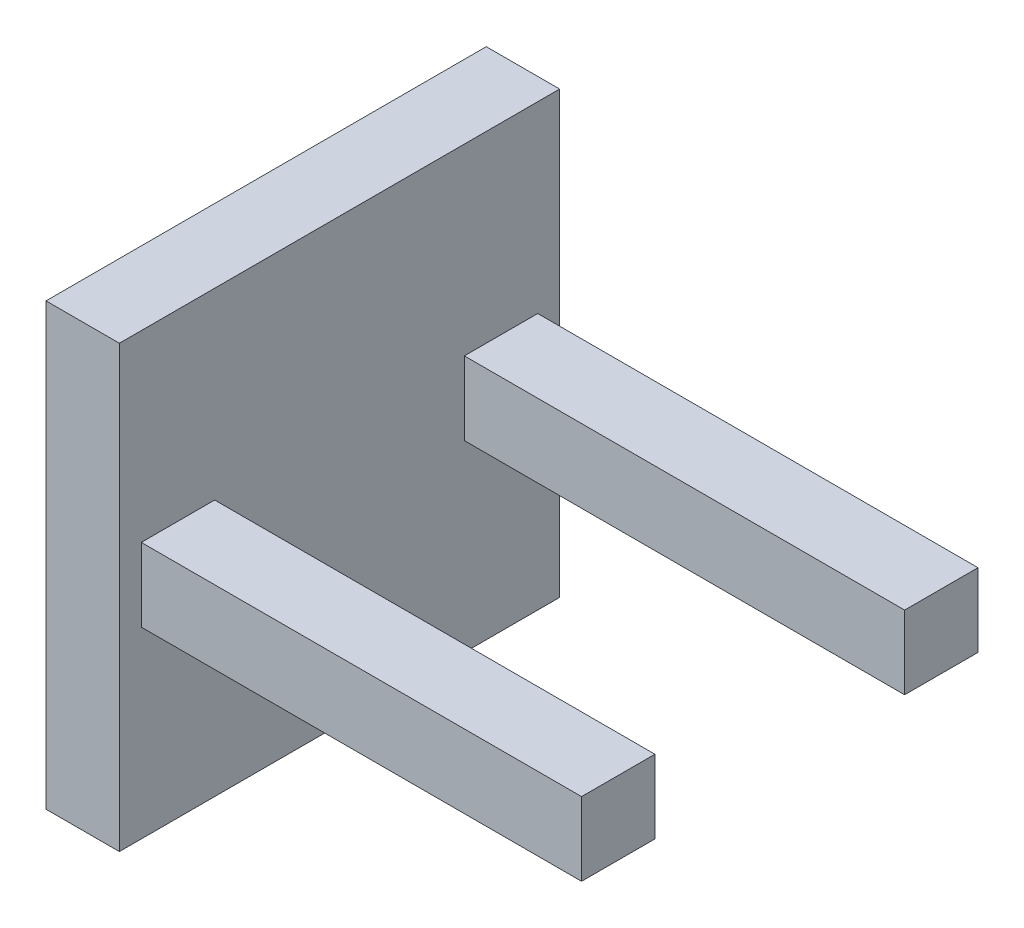
ISO-10303-21;
HEADER;
FILE_DESCRIPTION(('STEP AP214'),'2;1');
FILE_NAME('part.step','',(''),(''),'','','');
FILE_SCHEMA(('AUTOMOTIVE_DESIGN { 1 0 10303 214 1 1 1 1 }'));
ENDSEC;
DATA;
#1=APPLICATION_CONTEXT('core data for automotive mechanical design processes');
#2=APPLICATION_PROTOCOL_DEFINITION('international standard','automotive_design',2000,#1);
#3=PRODUCT_CONTEXT('',#1,'mechanical');
#4=PRODUCT('Part','Part','',(#3));
#5=PRODUCT_RELATED_PRODUCT_CATEGORY('part','',(#4));
#6=PRODUCT_DEFINITION_FORMATION('','',#4);
#7=PRODUCT_DEFINITION_CONTEXT('part definition',#1,'design');
#8=PRODUCT_DEFINITION('design','',#6,#7);
#9=PRODUCT_DEFINITION_SHAPE('','',#8);
#10=(LENGTH_UNIT() NAMED_UNIT(*) SI_UNIT(.MILLI.,.METRE.));
#11=(NAMED_UNIT(*) PLANE_ANGLE_UNIT() SI_UNIT($,.RADIAN.));
#12=(NAMED_UNIT(*) SI_UNIT($,.STERADIAN.) SOLID_ANGLE_UNIT());
#13=UNCERTAINTY_MEASURE_WITH_UNIT(LENGTH_MEASURE(1.E-05),#10,'distance_accuracy_value','');
#14=(GEOMETRIC_REPRESENTATION_CONTEXT(3) GLOBAL_UNCERTAINTY_ASSIGNED_CONTEXT((#13)) GLOBAL_UNIT_ASSIGNED_CONTEXT((#10,
#11,#12)) REPRESENTATION_CONTEXT('',''));
#15=CARTESIAN_POINT('',(0.,0.,0.));
#16=DIRECTION('',(0.,0.,1.));
#17=DIRECTION('',(1.,0.,0.));
#18=AXIS2_PLACEMENT_3D('',#15,#16,#17);
#19=CARTESIAN_POINT('',(5.,0.,0.));
#20=DIRECTION('',(1.,0.,0.));
#21=DIRECTION('',(0.,0.,-1.));
#22=AXIS2_PLACEMENT_3D('',#19,#20,#21);
#23=PLANE('',#22);
#24=DIRECTION('',(0.,0.,1.));
#25=VECTOR('',#24,1.);
#26=CARTESIAN_POINT('',(5.,2.5,-13.5070877826043));
#27=LINE('',#26,#25);
#28=CARTESIAN_POINT('',(5.,2.5,-13.5070877826043));
#29=VERTEX_POINT('',#28);
#30=CARTESIAN_POINT('',(5.,2.5,-8.50708778260429));
#31=VERTEX_POINT('',#30);
#32=EDGE_CURVE('E160',#29,#31,#27,.T.);
#33=ORIENTED_EDGE('',*,*,#32,.F.);
#34=DIRECTION('',(0.,-1.,0.));
#35=VECTOR('',#34,1.);
#36=CARTESIAN_POINT('',(5.,2.5,-13.5070877826043));
#37=LINE('',#36,#35);
#38=CARTESIAN_POINT('',(5.,-2.5,-13.5070877826043));
#39=VERTEX_POINT('',#38);
#40=EDGE_CURVE('E169',#29,#39,#37,.T.);
#41=ORIENTED_EDGE('',*,*,#40,.T.);
#42=DIRECTION('',(0.,0.,1.));
#43=VECTOR('',#42,1.);
#44=CARTESIAN_POINT('',(5.,-2.5,-13.5070877826043));
#45=LINE('',#44,#43);
#46=CARTESIAN_POINT('',(5.,-2.5,-8.50708778260429));
#47=VERTEX_POINT('',#46);
#48=EDGE_CURVE('E146',#39,#47,#45,.T.);
#49=ORIENTED_EDGE('',*,*,#48,.T.);
#50=DIRECTION('',(0.,-1.,0.));
#51=VECTOR('',#50,1.);
#52=CARTESIAN_POINT('',(5.,2.5,-8.50708778260429));
#53=LINE('',#52,#51);
#54=EDGE_CURVE('E183',#31,#47,#53,.T.);
#55=ORIENTED_EDGE('',*,*,#54,.F.);
#56=EDGE_LOOP('',(#33,#41,#49,#55));
#57=FACE_BOUND('',#56,.T.);
#58=DIRECTION('',(0.,1.,0.));
#59=VECTOR('',#58,1.);
#60=CARTESIAN_POINT('',(5.,15.,-15.));
#61=LINE('',#60,#59);
#62=CARTESIAN_POINT('',(5.,-15.,-15.));
#63=VERTEX_POINT('',#62);
#64=CARTESIAN_POINT('',(5.,15.,-15.));
#65=VERTEX_POINT('',#64);
#66=EDGE_CURVE('E186',#63,#65,#61,.T.);
#67=ORIENTED_EDGE('',*,*,#66,.T.);
#68=DIRECTION('',(0.,0.,1.));
#69=VECTOR('',#68,1.);
#70=CARTESIAN_POINT('',(5.,15.,15.));
#71=LINE('',#70,#69);
#72=CARTESIAN_POINT('',(5.,15.,15.));
#73=VERTEX_POINT('',#72);
#74=EDGE_CURVE('E189',#65,#73,#71,.T.);
#75=ORIENTED_EDGE('',*,*,#74,.T.);
#76=DIRECTION('',(0.,-1.,0.));
#77=VECTOR('',#76,1.);
#78=CARTESIAN_POINT('',(5.,15.,15.));
#79=LINE('',#78,#77);
#80=CARTESIAN_POINT('',(5.,-15.,15.));
#81=VERTEX_POINT('',#80);
#82=EDGE_CURVE('E192',#73,#81,#79,.T.);
#83=ORIENTED_EDGE('',*,*,#82,.T.);
#84=DIRECTION('',(0.,0.,-1.));
#85=VECTOR('',#84,1.);
#86=CARTESIAN_POINT('',(5.,-15.,15.));
#87=LINE('',#86,#85);
#88=EDGE_CURVE('E194',#81,#63,#87,.T.);
#89=ORIENTED_EDGE('',*,*,#88,.T.);
#90=EDGE_LOOP('',(#67,#75,#83,#89));
#91=FACE_BOUND('',#90,.T.);
#92=DIRECTION('',(0.,-1.,0.));
#93=VECTOR('',#92,1.);
#94=CARTESIAN_POINT('',(5.,2.5,13.5070877826043));
#95=LINE('',#94,#93);
#96=CARTESIAN_POINT('',(5.,2.5,13.5070877826043));
#97=VERTEX_POINT('',#96);
#98=CARTESIAN_POINT('',(5.,-2.5,13.5070877826043));
#99=VERTEX_POINT('',#98);
#100=EDGE_CURVE('E54',#97,#99,#95,.T.);
#101=ORIENTED_EDGE('',*,*,#100,.F.);
#102=DIRECTION('',(0.,0.,1.));
#103=VECTOR('',#102,1.);
#104=CARTESIAN_POINT('',(5.,2.5,13.5070877826043));
#105=LINE('',#104,#103);
#106=CARTESIAN_POINT('',(5.,2.5,8.50708778260429));
#107=VERTEX_POINT('',#106);
#108=EDGE_CURVE('E59',#107,#97,#105,.T.);
#109=ORIENTED_EDGE('',*,*,#108,.F.);
#110=DIRECTION('',(0.,-1.,0.));
#111=VECTOR('',#110,1.);
#112=CARTESIAN_POINT('',(5.,2.5,8.50708778260429));
#113=LINE('',#112,#111);
#114=CARTESIAN_POINT('',(5.,-2.5,8.50708778260429));
#115=VERTEX_POINT('',#114);
#116=EDGE_CURVE('E125',#107,#115,#113,.T.);
#117=ORIENTED_EDGE('',*,*,#116,.T.);
#118=DIRECTION('',(0.,0.,1.));
#119=VECTOR('',#118,1.);
#120=CARTESIAN_POINT('',(5.,-2.5,13.5070877826043));
#121=LINE('',#120,#119);
#122=EDGE_CURVE('E128',#115,#99,#121,.T.);
#123=ORIENTED_EDGE('',*,*,#122,.T.);
#124=EDGE_LOOP('',(#101,#109,#117,#123));
#125=FACE_BOUND('',#124,.T.);
#126=ADVANCED_FACE('F39',(#57,#91,#125),#23,.T.);
#127=CARTESIAN_POINT('',(5.,15.,-15.));
#128=DIRECTION('',(0.,0.,1.));
#129=DIRECTION('',(0.,-1.,0.));
#130=AXIS2_PLACEMENT_3D('',#127,#128,#129);
#131=PLANE('',#130);
#132=DIRECTION('',(0.,1.,0.));
#133=VECTOR('',#132,1.);
#134=CARTESIAN_POINT('',(0.,15.,-15.));
#135=LINE('',#134,#133);
#136=CARTESIAN_POINT('',(0.,-15.,-15.));
#137=VERTEX_POINT('',#136);
#138=CARTESIAN_POINT('',(0.,15.,-15.));
#139=VERTEX_POINT('',#138);
#140=EDGE_CURVE('E185',#137,#139,#135,.T.);
#141=ORIENTED_EDGE('',*,*,#140,.T.);
#142=DIRECTION('',(-1.,0.,0.));
#143=VECTOR('',#142,1.);
#144=CARTESIAN_POINT('',(5.,15.,-15.));
#145=LINE('',#144,#143);
#146=EDGE_CURVE('E11',#65,#139,#145,.T.);
#147=ORIENTED_EDGE('',*,*,#146,.F.);
#148=ORIENTED_EDGE('',*,*,#66,.F.);
#149=DIRECTION('',(-1.,0.,0.));
#150=VECTOR('',#149,1.);
#151=CARTESIAN_POINT('',(5.,-15.,-15.));
#152=LINE('',#151,#150);
#153=EDGE_CURVE('E196',#63,#137,#152,.T.);
#154=ORIENTED_EDGE('',*,*,#153,.T.);
#155=EDGE_LOOP('',(#141,#147,#148,#154));
#156=FACE_BOUND('',#155,.T.);
#157=ADVANCED_FACE('F41',(#156),#131,.F.);
#158=CARTESIAN_POINT('',(5.,15.,15.));
#159=DIRECTION('',(0.,-1.,0.));
#160=DIRECTION('',(0.,0.,-1.));
#161=AXIS2_PLACEMENT_3D('',#158,#159,#160);
#162=PLANE('',#161);
#163=DIRECTION('',(0.,0.,1.));
#164=VECTOR('',#163,1.);
#165=CARTESIAN_POINT('',(0.,15.,15.));
#166=LINE('',#165,#164);
#167=CARTESIAN_POINT('',(0.,15.,15.));
#168=VERTEX_POINT('',#167);
#169=EDGE_CURVE('E199',#139,#168,#166,.T.);
#170=ORIENTED_EDGE('',*,*,#169,.T.);
#171=DIRECTION('',(-1.,0.,0.));
#172=VECTOR('',#171,1.);
#173=CARTESIAN_POINT('',(5.,15.,15.));
#174=LINE('',#173,#172);
#175=EDGE_CURVE('E47',#73,#168,#174,.T.);
#176=ORIENTED_EDGE('',*,*,#175,.F.);
#177=ORIENTED_EDGE('',*,*,#74,.F.);
#178=ORIENTED_EDGE('',*,*,#146,.T.);
#179=EDGE_LOOP('',(#170,#176,#177,#178));
#180=FACE_BOUND('',#179,.T.);
#181=ADVANCED_FACE('F228',(#180),#162,.F.);
#182=CARTESIAN_POINT('',(5.,15.,15.));
#183=DIRECTION('',(0.,0.,-1.));
#184=DIRECTION('',(0.,1.,0.));
#185=AXIS2_PLACEMENT_3D('',#182,#183,#184);
#186=PLANE('',#185);
#187=DIRECTION('',(0.,-1.,0.));
#188=VECTOR('',#187,1.);
#189=CARTESIAN_POINT('',(0.,15.,15.));
#190=LINE('',#189,#188);
#191=CARTESIAN_POINT('',(0.,-15.,15.));
#192=VERTEX_POINT('',#191);
#193=EDGE_CURVE('E201',#168,#192,#190,.T.);
#194=ORIENTED_EDGE('',*,*,#193,.T.);
#195=DIRECTION('',(-1.,0.,0.));
#196=VECTOR('',#195,1.);
#197=CARTESIAN_POINT('',(5.,-15.,15.));
#198=LINE('',#197,#196);
#199=EDGE_CURVE('E206',#81,#192,#198,.T.);
#200=ORIENTED_EDGE('',*,*,#199,.F.);
#201=ORIENTED_EDGE('',*,*,#82,.F.);
#202=ORIENTED_EDGE('',*,*,#175,.T.);
#203=EDGE_LOOP('',(#194,#200,#201,#202));
#204=FACE_BOUND('',#203,.T.);
#205=ADVANCED_FACE('F213',(#204),#186,.F.);
#206=CARTESIAN_POINT('',(5.,-15.,15.));
#207=DIRECTION('',(0.,1.,0.));
#208=DIRECTION('',(0.,0.,1.));
#209=AXIS2_PLACEMENT_3D('',#206,#207,#208);
#210=PLANE('',#209);
#211=DIRECTION('',(0.,0.,-1.));
#212=VECTOR('',#211,1.);
#213=CARTESIAN_POINT('',(0.,-15.,15.));
#214=LINE('',#213,#212);
#215=EDGE_CURVE('E190',#192,#137,#214,.T.);
#216=ORIENTED_EDGE('',*,*,#215,.T.);
#217=ORIENTED_EDGE('',*,*,#153,.F.);
#218=ORIENTED_EDGE('',*,*,#88,.F.);
#219=ORIENTED_EDGE('',*,*,#199,.T.);
#220=EDGE_LOOP('',(#216,#217,#218,#219));
#221=FACE_BOUND('',#220,.T.);
#222=ADVANCED_FACE('F222',(#221),#210,.F.);
#223=CARTESIAN_POINT('',(0.,0.,0.));
#224=DIRECTION('',(1.,0.,0.));
#225=DIRECTION('',(0.,0.,-1.));
#226=AXIS2_PLACEMENT_3D('',#223,#224,#225);
#227=PLANE('',#226);
#228=ORIENTED_EDGE('',*,*,#140,.F.);
#229=ORIENTED_EDGE('',*,*,#215,.F.);
#230=ORIENTED_EDGE('',*,*,#193,.F.);
#231=ORIENTED_EDGE('',*,*,#169,.F.);
#232=EDGE_LOOP('',(#228,#229,#230,#231));
#233=FACE_BOUND('',#232,.T.);
#234=ADVANCED_FACE('F219',(#233),#227,.F.);
#235=CARTESIAN_POINT('',(5.,2.5,-8.50708778260429));
#236=DIRECTION('',(0.,0.,-1.));
#237=DIRECTION('',(-1.,0.,0.));
#238=AXIS2_PLACEMENT_3D('',#235,#236,#237);
#239=PLANE('',#238);
#240=DIRECTION('',(1.,0.,0.));
#241=VECTOR('',#240,1.);
#242=CARTESIAN_POINT('',(5.,-2.5,-8.50708778260429));
#243=LINE('',#242,#241);
#244=CARTESIAN_POINT('',(35.,-2.5,-8.50708778260429));
#245=VERTEX_POINT('',#244);
#246=EDGE_CURVE('E149',#47,#245,#243,.T.);
#247=ORIENTED_EDGE('',*,*,#246,.T.);
#248=DIRECTION('',(0.,-1.,0.));
#249=VECTOR('',#248,1.);
#250=CARTESIAN_POINT('',(35.,2.5,-8.50708778260429));
#251=LINE('',#250,#249);
#252=CARTESIAN_POINT('',(35.,2.5,-8.50708778260429));
#253=VERTEX_POINT('',#252);
#254=EDGE_CURVE('E180',#253,#245,#251,.T.);
#255=ORIENTED_EDGE('',*,*,#254,.F.);
#256=DIRECTION('',(1.,0.,0.));
#257=VECTOR('',#256,1.);
#258=CARTESIAN_POINT('',(5.,2.5,-8.50708778260429));
#259=LINE('',#258,#257);
#260=EDGE_CURVE('E163',#31,#253,#259,.T.);
#261=ORIENTED_EDGE('',*,*,#260,.F.);
#262=ORIENTED_EDGE('',*,*,#54,.T.);
#263=EDGE_LOOP('',(#247,#255,#261,#262));
#264=FACE_BOUND('',#263,.T.);
#265=ADVANCED_FACE('F245',(#264),#239,.F.);
#266=CARTESIAN_POINT('',(35.,2.5,-13.5070877826043));
#267=DIRECTION('',(-1.,0.,0.));
#268=DIRECTION('',(0.,0.,1.));
#269=AXIS2_PLACEMENT_3D('',#266,#267,#268);
#270=PLANE('',#269);
#271=DIRECTION('',(0.,0.,-1.));
#272=VECTOR('',#271,1.);
#273=CARTESIAN_POINT('',(35.,-2.5,-13.5070877826043));
#274=LINE('',#273,#272);
#275=CARTESIAN_POINT('',(35.,-2.5,-13.5070877826043));
#276=VERTEX_POINT('',#275);
#277=EDGE_CURVE('E172',#245,#276,#274,.T.);
#278=ORIENTED_EDGE('',*,*,#277,.T.);
#279=DIRECTION('',(0.,-1.,0.));
#280=VECTOR('',#279,1.);
#281=CARTESIAN_POINT('',(35.,2.5,-13.5070877826043));
#282=LINE('',#281,#280);
#283=CARTESIAN_POINT('',(35.,2.5,-13.5070877826043));
#284=VERTEX_POINT('',#283);
#285=EDGE_CURVE('E177',#284,#276,#282,.T.);
#286=ORIENTED_EDGE('',*,*,#285,.F.);
#287=DIRECTION('',(0.,0.,-1.));
#288=VECTOR('',#287,1.);
#289=CARTESIAN_POINT('',(35.,2.5,-13.5070877826043));
#290=LINE('',#289,#288);
#291=EDGE_CURVE('E166',#253,#284,#290,.T.);
#292=ORIENTED_EDGE('',*,*,#291,.F.);
#293=ORIENTED_EDGE('',*,*,#254,.T.);
#294=EDGE_LOOP('',(#278,#286,#292,#293));
#295=FACE_BOUND('',#294,.T.);
#296=ADVANCED_FACE('F271',(#295),#270,.F.);
#297=CARTESIAN_POINT('',(5.,2.5,-13.5070877826043));
#298=DIRECTION('',(0.,0.,1.));
#299=DIRECTION('',(1.,0.,0.));
#300=AXIS2_PLACEMENT_3D('',#297,#298,#299);
#301=PLANE('',#300);
#302=DIRECTION('',(-1.,0.,0.));
#303=VECTOR('',#302,1.);
#304=CARTESIAN_POINT('',(5.,-2.5,-13.5070877826043));
#305=LINE('',#304,#303);
#306=EDGE_CURVE('E164',#276,#39,#305,.T.);
#307=ORIENTED_EDGE('',*,*,#306,.T.);
#308=ORIENTED_EDGE('',*,*,#40,.F.);
#309=DIRECTION('',(-1.,0.,0.));
#310=VECTOR('',#309,1.);
#311=CARTESIAN_POINT('',(5.,2.5,-13.5070877826043));
#312=LINE('',#311,#310);
#313=EDGE_CURVE('E168',#284,#29,#312,.T.);
#314=ORIENTED_EDGE('',*,*,#313,.F.);
#315=ORIENTED_EDGE('',*,*,#285,.T.);
#316=EDGE_LOOP('',(#307,#308,#314,#315));
#317=FACE_BOUND('',#316,.T.);
#318=ADVANCED_FACE('F280',(#317),#301,.F.);
#319=CARTESIAN_POINT('',(0.,2.5,0.));
#320=DIRECTION('',(0.,1.,0.));
#321=DIRECTION('',(0.,0.,1.));
#322=AXIS2_PLACEMENT_3D('',#319,#320,#321);
#323=PLANE('',#322);
#324=ORIENTED_EDGE('',*,*,#32,.T.);
#325=ORIENTED_EDGE('',*,*,#260,.T.);
#326=ORIENTED_EDGE('',*,*,#291,.T.);
#327=ORIENTED_EDGE('',*,*,#313,.T.);
#328=EDGE_LOOP('',(#324,#325,#326,#327));
#329=FACE_BOUND('',#328,.T.);
#330=ADVANCED_FACE('F289',(#329),#323,.T.);
#331=CARTESIAN_POINT('',(0.,-2.5,0.));
#332=DIRECTION('',(0.,1.,0.));
#333=DIRECTION('',(0.,0.,1.));
#334=AXIS2_PLACEMENT_3D('',#331,#332,#333);
#335=PLANE('',#334);
#336=ORIENTED_EDGE('',*,*,#48,.F.);
#337=ORIENTED_EDGE('',*,*,#306,.F.);
#338=ORIENTED_EDGE('',*,*,#277,.F.);
#339=ORIENTED_EDGE('',*,*,#246,.F.);
#340=EDGE_LOOP('',(#336,#337,#338,#339));
#341=FACE_BOUND('',#340,.T.);
#342=ADVANCED_FACE('F299',(#341),#335,.F.);
#343=CARTESIAN_POINT('',(5.,2.5,13.5070877826043));
#344=DIRECTION('',(0.,0.,-1.));
#345=DIRECTION('',(-1.,0.,0.));
#346=AXIS2_PLACEMENT_3D('',#343,#344,#345);
#347=PLANE('',#346);
#348=DIRECTION('',(1.,0.,0.));
#349=VECTOR('',#348,1.);
#350=CARTESIAN_POINT('',(5.,-2.5,13.5070877826043));
#351=LINE('',#350,#349);
#352=CARTESIAN_POINT('',(35.,-2.5,13.5070877826043));
#353=VERTEX_POINT('',#352);
#354=EDGE_CURVE('E145',#99,#353,#351,.T.);
#355=ORIENTED_EDGE('',*,*,#354,.T.);
#356=DIRECTION('',(0.,-1.,0.));
#357=VECTOR('',#356,1.);
#358=CARTESIAN_POINT('',(35.,2.5,13.5070877826043));
#359=LINE('',#358,#357);
#360=CARTESIAN_POINT('',(35.,2.5,13.5070877826043));
#361=VERTEX_POINT('',#360);
#362=EDGE_CURVE('E361',#361,#353,#359,.T.);
#363=ORIENTED_EDGE('',*,*,#362,.F.);
#364=DIRECTION('',(1.,0.,0.));
#365=VECTOR('',#364,1.);
#366=CARTESIAN_POINT('',(5.,2.5,13.5070877826043));
#367=LINE('',#366,#365);
#368=EDGE_CURVE('E157',#97,#361,#367,.T.);
#369=ORIENTED_EDGE('',*,*,#368,.F.);
#370=ORIENTED_EDGE('',*,*,#100,.T.);
#371=EDGE_LOOP('',(#355,#363,#369,#370));
#372=FACE_BOUND('',#371,.T.);
#373=ADVANCED_FACE('F309',(#372),#347,.F.);
#374=CARTESIAN_POINT('',(35.,2.5,13.5070877826043));
#375=DIRECTION('',(-1.,0.,0.));
#376=DIRECTION('',(0.,0.,1.));
#377=AXIS2_PLACEMENT_3D('',#374,#375,#376);
#378=PLANE('',#377);
#379=DIRECTION('',(0.,0.,-1.));
#380=VECTOR('',#379,1.);
#381=CARTESIAN_POINT('',(35.,-2.5,13.5070877826043));
#382=LINE('',#381,#380);
#383=CARTESIAN_POINT('',(35.,-2.5,8.50708778260429));
#384=VERTEX_POINT('',#383);
#385=EDGE_CURVE('E142',#353,#384,#382,.T.);
#386=ORIENTED_EDGE('',*,*,#385,.T.);
#387=DIRECTION('',(0.,-1.,0.));
#388=VECTOR('',#387,1.);
#389=CARTESIAN_POINT('',(35.,2.5,8.50708778260429));
#390=LINE('',#389,#388);
#391=CARTESIAN_POINT('',(35.,2.5,8.50708778260429));
#392=VERTEX_POINT('',#391);
#393=EDGE_CURVE('E133',#392,#384,#390,.T.);
#394=ORIENTED_EDGE('',*,*,#393,.F.);
#395=DIRECTION('',(0.,0.,-1.));
#396=VECTOR('',#395,1.);
#397=CARTESIAN_POINT('',(35.,2.5,13.5070877826043));
#398=LINE('',#397,#396);
#399=EDGE_CURVE('E155',#361,#392,#398,.T.);
#400=ORIENTED_EDGE('',*,*,#399,.F.);
#401=ORIENTED_EDGE('',*,*,#362,.T.);
#402=EDGE_LOOP('',(#386,#394,#400,#401));
#403=FACE_BOUND('',#402,.T.);
#404=ADVANCED_FACE('F319',(#403),#378,.F.);
#405=CARTESIAN_POINT('',(5.,2.5,8.50708778260429));
#406=DIRECTION('',(0.,0.,1.));
#407=DIRECTION('',(1.,0.,0.));
#408=AXIS2_PLACEMENT_3D('',#405,#406,#407);
#409=PLANE('',#408);
#410=DIRECTION('',(-1.,0.,0.));
#411=VECTOR('',#410,1.);
#412=CARTESIAN_POINT('',(5.,-2.5,8.50708778260429));
#413=LINE('',#412,#411);
#414=EDGE_CURVE('E137',#384,#115,#413,.T.);
#415=ORIENTED_EDGE('',*,*,#414,.T.);
#416=ORIENTED_EDGE('',*,*,#116,.F.);
#417=DIRECTION('',(-1.,0.,0.));
#418=VECTOR('',#417,1.);
#419=CARTESIAN_POINT('',(5.,2.5,8.50708778260429));
#420=LINE('',#419,#418);
#421=EDGE_CURVE('E132',#392,#107,#420,.T.);
#422=ORIENTED_EDGE('',*,*,#421,.F.);
#423=ORIENTED_EDGE('',*,*,#393,.T.);
#424=EDGE_LOOP('',(#415,#416,#422,#423));
#425=FACE_BOUND('',#424,.T.);
#426=ADVANCED_FACE('F138',(#425),#409,.F.);
#427=CARTESIAN_POINT('',(0.,2.5,0.));
#428=DIRECTION('',(0.,-1.,0.));
#429=DIRECTION('',(0.,0.,-1.));
#430=AXIS2_PLACEMENT_3D('',#427,#428,#429);
#431=PLANE('',#430);
#432=ORIENTED_EDGE('',*,*,#108,.T.);
#433=ORIENTED_EDGE('',*,*,#368,.T.);
#434=ORIENTED_EDGE('',*,*,#399,.T.);
#435=ORIENTED_EDGE('',*,*,#421,.T.);
#436=EDGE_LOOP('',(#432,#433,#434,#435));
#437=FACE_BOUND('',#436,.T.);
#438=ADVANCED_FACE('F338',(#437),#431,.F.);
#439=CARTESIAN_POINT('',(0.,-2.5,0.));
#440=DIRECTION('',(0.,-1.,0.));
#441=DIRECTION('',(0.,0.,-1.));
#442=AXIS2_PLACEMENT_3D('',#439,#440,#441);
#443=PLANE('',#442);
#444=ORIENTED_EDGE('',*,*,#122,.F.);
#445=ORIENTED_EDGE('',*,*,#414,.F.);
#446=ORIENTED_EDGE('',*,*,#385,.F.);
#447=ORIENTED_EDGE('',*,*,#354,.F.);
#448=EDGE_LOOP('',(#444,#445,#446,#447));
#449=FACE_BOUND('',#448,.T.);
#450=ADVANCED_FACE('F144',(#449),#443,.T.);
#451=CLOSED_SHELL('',(#126,#157,#181,#205,#222,#234,#265,#296,#318,#330,#342,#373,#404,#426,
#438,#450));
#452=MANIFOLD_SOLID_BREP('B2',#451);
#453=ADVANCED_BREP_SHAPE_REPRESENTATION('',(#18,#452),#14);
#454=SHAPE_DEFINITION_REPRESENTATION(#9,#453);
ENDSEC;
END-ISO-10303-21;
